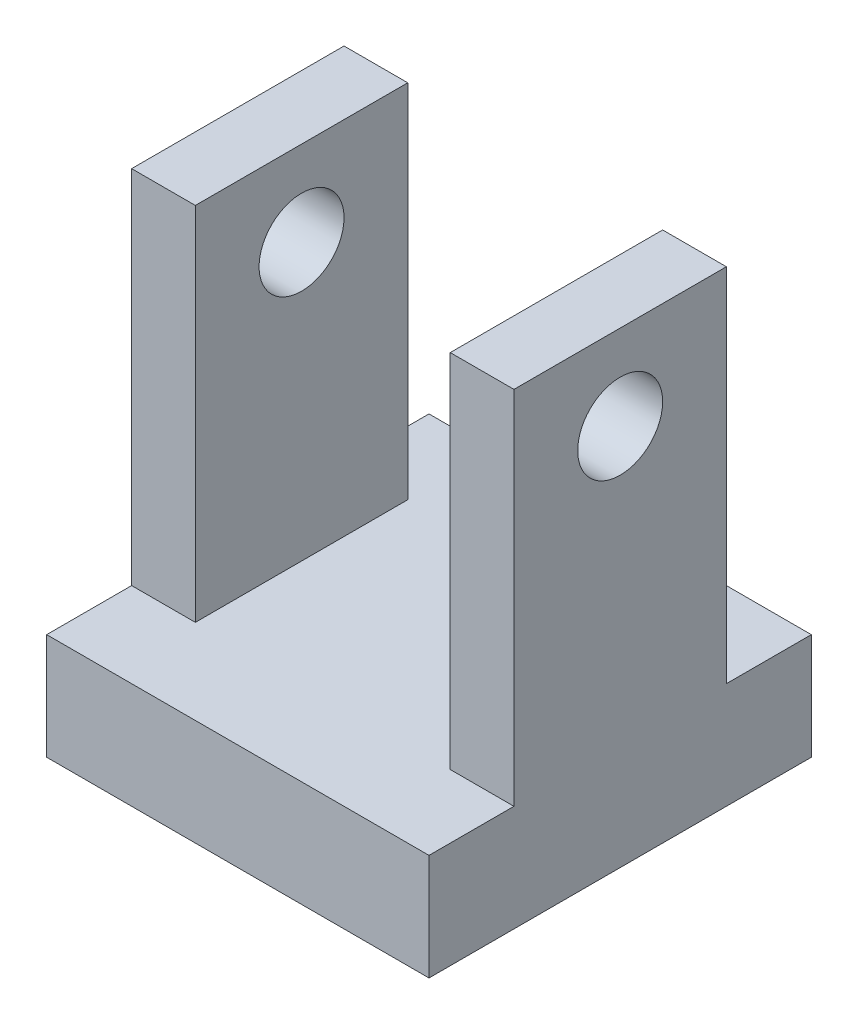
ISO-10303-21;
HEADER;
FILE_DESCRIPTION(('STEP AP214'),'2;1');
FILE_NAME('part.step','',(''),(''),'','','');
FILE_SCHEMA(('AUTOMOTIVE_DESIGN { 1 0 10303 214 1 1 1 1 }'));
ENDSEC;
DATA;
#1=APPLICATION_CONTEXT('core data for automotive mechanical design processes');
#2=APPLICATION_PROTOCOL_DEFINITION('international standard','automotive_design',2000,#1);
#3=PRODUCT_CONTEXT('',#1,'mechanical');
#4=PRODUCT('Part','Part','',(#3));
#5=PRODUCT_RELATED_PRODUCT_CATEGORY('part','',(#4));
#6=PRODUCT_DEFINITION_FORMATION('','',#4);
#7=PRODUCT_DEFINITION_CONTEXT('part definition',#1,'design');
#8=PRODUCT_DEFINITION('design','',#6,#7);
#9=PRODUCT_DEFINITION_SHAPE('','',#8);
#10=(LENGTH_UNIT() NAMED_UNIT(*) SI_UNIT(.MILLI.,.METRE.));
#11=(NAMED_UNIT(*) PLANE_ANGLE_UNIT() SI_UNIT($,.RADIAN.));
#12=(NAMED_UNIT(*) SI_UNIT($,.STERADIAN.) SOLID_ANGLE_UNIT());
#13=UNCERTAINTY_MEASURE_WITH_UNIT(LENGTH_MEASURE(1.E-05),#10,'distance_accuracy_value','');
#14=(GEOMETRIC_REPRESENTATION_CONTEXT(3) GLOBAL_UNCERTAINTY_ASSIGNED_CONTEXT((#13)) GLOBAL_UNIT_ASSIGNED_CONTEXT((#10,
#11,#12)) REPRESENTATION_CONTEXT('',''));
#15=CARTESIAN_POINT('',(0.,0.,0.));
#16=DIRECTION('',(0.,0.,1.));
#17=DIRECTION('',(1.,0.,0.));
#18=AXIS2_PLACEMENT_3D('',#15,#16,#17);
#19=CARTESIAN_POINT('',(45.,110.,-25.));
#20=DIRECTION('',(0.,0.,1.));
#21=DIRECTION('',(0.,-1.,0.));
#22=AXIS2_PLACEMENT_3D('',#19,#20,#21);
#23=PLANE('',#22);
#24=DIRECTION('',(-1.,0.,0.));
#25=VECTOR('',#24,1.);
#26=CARTESIAN_POINT('',(45.,110.,-25.));
#27=LINE('',#26,#25);
#28=CARTESIAN_POINT('',(-30.,110.,-25.));
#29=VERTEX_POINT('',#28);
#30=CARTESIAN_POINT('',(-45.,110.,-25.));
#31=VERTEX_POINT('',#30);
#32=EDGE_CURVE('E140',#29,#31,#27,.T.);
#33=ORIENTED_EDGE('',*,*,#32,.F.);
#34=DIRECTION('',(0.,-1.,0.));
#35=VECTOR('',#34,1.);
#36=CARTESIAN_POINT('',(-30.,110.,-25.));
#37=LINE('',#36,#35);
#38=CARTESIAN_POINT('',(-30.,25.,-25.));
#39=VERTEX_POINT('',#38);
#40=EDGE_CURVE('E155',#29,#39,#37,.T.);
#41=ORIENTED_EDGE('',*,*,#40,.T.);
#42=DIRECTION('',(-1.,0.,0.));
#43=VECTOR('',#42,1.);
#44=CARTESIAN_POINT('',(45.,25.,-25.));
#45=LINE('',#44,#43);
#46=CARTESIAN_POINT('',(-45.,25.,-25.));
#47=VERTEX_POINT('',#46);
#48=EDGE_CURVE('E179',#39,#47,#45,.T.);
#49=ORIENTED_EDGE('',*,*,#48,.T.);
#50=DIRECTION('',(0.,1.,0.));
#51=VECTOR('',#50,1.);
#52=CARTESIAN_POINT('',(-45.,110.,-25.));
#53=LINE('',#52,#51);
#54=EDGE_CURVE('E163',#47,#31,#53,.T.);
#55=ORIENTED_EDGE('',*,*,#54,.T.);
#56=EDGE_LOOP('',(#33,#41,#49,#55));
#57=FACE_BOUND('',#56,.T.);
#58=ADVANCED_FACE('F39',(#57),#23,.F.);
#59=CARTESIAN_POINT('',(45.,110.,25.));
#60=DIRECTION('',(0.,-1.,0.));
#61=DIRECTION('',(0.,0.,-1.));
#62=AXIS2_PLACEMENT_3D('',#59,#60,#61);
#63=PLANE('',#62);
#64=DIRECTION('',(-1.,0.,0.));
#65=VECTOR('',#64,1.);
#66=CARTESIAN_POINT('',(45.,110.,25.));
#67=LINE('',#66,#65);
#68=CARTESIAN_POINT('',(-30.,110.,25.));
#69=VERTEX_POINT('',#68);
#70=CARTESIAN_POINT('',(-45.,110.,25.));
#71=VERTEX_POINT('',#70);
#72=EDGE_CURVE('E141',#69,#71,#67,.T.);
#73=ORIENTED_EDGE('',*,*,#72,.F.);
#74=DIRECTION('',(0.,0.,1.));
#75=VECTOR('',#74,1.);
#76=CARTESIAN_POINT('',(-30.,110.,-65.));
#77=LINE('',#76,#75);
#78=EDGE_CURVE('E215',#29,#69,#77,.T.);
#79=ORIENTED_EDGE('',*,*,#78,.F.);
#80=ORIENTED_EDGE('',*,*,#32,.T.);
#81=DIRECTION('',(0.,0.,1.));
#82=VECTOR('',#81,1.);
#83=CARTESIAN_POINT('',(-45.,110.,25.));
#84=LINE('',#83,#82);
#85=EDGE_CURVE('E166',#31,#71,#84,.T.);
#86=ORIENTED_EDGE('',*,*,#85,.T.);
#87=EDGE_LOOP('',(#73,#79,#80,#86));
#88=FACE_BOUND('',#87,.T.);
#89=ADVANCED_FACE('F256',(#88),#63,.F.);
#90=CARTESIAN_POINT('',(45.,25.,25.));
#91=DIRECTION('',(0.,0.,-1.));
#92=DIRECTION('',(-1.,0.,0.));
#93=AXIS2_PLACEMENT_3D('',#90,#91,#92);
#94=PLANE('',#93);
#95=DIRECTION('',(-1.,0.,0.));
#96=VECTOR('',#95,1.);
#97=CARTESIAN_POINT('',(45.,25.,25.));
#98=LINE('',#97,#96);
#99=CARTESIAN_POINT('',(-30.,25.,25.));
#100=VERTEX_POINT('',#99);
#101=CARTESIAN_POINT('',(-45.,25.,25.));
#102=VERTEX_POINT('',#101);
#103=EDGE_CURVE('E175',#100,#102,#98,.T.);
#104=ORIENTED_EDGE('',*,*,#103,.F.);
#105=DIRECTION('',(0.,-1.,0.));
#106=VECTOR('',#105,1.);
#107=CARTESIAN_POINT('',(-30.,25.,25.));
#108=LINE('',#107,#106);
#109=EDGE_CURVE('E55',#69,#100,#108,.T.);
#110=ORIENTED_EDGE('',*,*,#109,.F.);
#111=ORIENTED_EDGE('',*,*,#72,.T.);
#112=DIRECTION('',(0.,-1.,0.));
#113=VECTOR('',#112,1.);
#114=CARTESIAN_POINT('',(-45.,25.,25.));
#115=LINE('',#114,#113);
#116=EDGE_CURVE('E169',#71,#102,#115,.T.);
#117=ORIENTED_EDGE('',*,*,#116,.T.);
#118=EDGE_LOOP('',(#104,#110,#111,#117));
#119=FACE_BOUND('',#118,.T.);
#120=ADVANCED_FACE('F264',(#119),#94,.F.);
#121=CARTESIAN_POINT('',(45.,0.,45.));
#122=DIRECTION('',(0.,0.,-1.));
#123=DIRECTION('',(-1.,0.,0.));
#124=AXIS2_PLACEMENT_3D('',#121,#122,#123);
#125=PLANE('',#124);
#126=DIRECTION('',(0.,-1.,0.));
#127=VECTOR('',#126,1.);
#128=CARTESIAN_POINT('',(-45.,0.,45.));
#129=LINE('',#128,#127);
#130=CARTESIAN_POINT('',(-45.,25.,45.));
#131=VERTEX_POINT('',#130);
#132=CARTESIAN_POINT('',(-45.,0.,45.));
#133=VERTEX_POINT('',#132);
#134=EDGE_CURVE('E151',#131,#133,#129,.T.);
#135=ORIENTED_EDGE('',*,*,#134,.T.);
#136=DIRECTION('',(-1.,0.,0.));
#137=VECTOR('',#136,1.);
#138=CARTESIAN_POINT('',(45.,0.,45.));
#139=LINE('',#138,#137);
#140=CARTESIAN_POINT('',(45.,0.,45.));
#141=VERTEX_POINT('',#140);
#142=EDGE_CURVE('E11',#141,#133,#139,.T.);
#143=ORIENTED_EDGE('',*,*,#142,.F.);
#144=DIRECTION('',(0.,-1.,0.));
#145=VECTOR('',#144,1.);
#146=CARTESIAN_POINT('',(45.,0.,45.));
#147=LINE('',#146,#145);
#148=CARTESIAN_POINT('',(45.,25.,45.));
#149=VERTEX_POINT('',#148);
#150=EDGE_CURVE('E173',#149,#141,#147,.T.);
#151=ORIENTED_EDGE('',*,*,#150,.F.);
#152=DIRECTION('',(-1.,0.,0.));
#153=VECTOR('',#152,1.);
#154=CARTESIAN_POINT('',(45.,25.,45.));
#155=LINE('',#154,#153);
#156=EDGE_CURVE('E147',#149,#131,#155,.T.);
#157=ORIENTED_EDGE('',*,*,#156,.T.);
#158=EDGE_LOOP('',(#135,#143,#151,#157));
#159=FACE_BOUND('',#158,.T.);
#160=ADVANCED_FACE('F41',(#159),#125,.F.);
#161=CARTESIAN_POINT('',(45.,0.,-45.));
#162=DIRECTION('',(0.,1.,0.));
#163=DIRECTION('',(0.,0.,1.));
#164=AXIS2_PLACEMENT_3D('',#161,#162,#163);
#165=PLANE('',#164);
#166=DIRECTION('',(0.,0.,-1.));
#167=VECTOR('',#166,1.);
#168=CARTESIAN_POINT('',(-45.,0.,-45.));
#169=LINE('',#168,#167);
#170=CARTESIAN_POINT('',(-45.,0.,-45.));
#171=VERTEX_POINT('',#170);
#172=EDGE_CURVE('E154',#133,#171,#169,.T.);
#173=ORIENTED_EDGE('',*,*,#172,.T.);
#174=DIRECTION('',(-1.,0.,0.));
#175=VECTOR('',#174,1.);
#176=CARTESIAN_POINT('',(45.,0.,-45.));
#177=LINE('',#176,#175);
#178=CARTESIAN_POINT('',(45.,0.,-45.));
#179=VERTEX_POINT('',#178);
#180=EDGE_CURVE('E48',#179,#171,#177,.T.);
#181=ORIENTED_EDGE('',*,*,#180,.F.);
#182=DIRECTION('',(0.,0.,-1.));
#183=VECTOR('',#182,1.);
#184=CARTESIAN_POINT('',(45.,0.,-45.));
#185=LINE('',#184,#183);
#186=EDGE_CURVE('E104',#141,#179,#185,.T.);
#187=ORIENTED_EDGE('',*,*,#186,.F.);
#188=ORIENTED_EDGE('',*,*,#142,.T.);
#189=EDGE_LOOP('',(#173,#181,#187,#188));
#190=FACE_BOUND('',#189,.T.);
#191=ADVANCED_FACE('F275',(#190),#165,.F.);
#192=CARTESIAN_POINT('',(45.,25.,-45.));
#193=DIRECTION('',(0.,0.,1.));
#194=DIRECTION('',(0.,-1.,0.));
#195=AXIS2_PLACEMENT_3D('',#192,#193,#194);
#196=PLANE('',#195);
#197=DIRECTION('',(0.,1.,0.));
#198=VECTOR('',#197,1.);
#199=CARTESIAN_POINT('',(-45.,25.,-45.));
#200=LINE('',#199,#198);
#201=CARTESIAN_POINT('',(-45.,25.,-45.));
#202=VERTEX_POINT('',#201);
#203=EDGE_CURVE('E157',#171,#202,#200,.T.);
#204=ORIENTED_EDGE('',*,*,#203,.T.);
#205=DIRECTION('',(-1.,0.,0.));
#206=VECTOR('',#205,1.);
#207=CARTESIAN_POINT('',(45.,25.,-45.));
#208=LINE('',#207,#206);
#209=CARTESIAN_POINT('',(45.,25.,-45.));
#210=VERTEX_POINT('',#209);
#211=EDGE_CURVE('E183',#210,#202,#208,.T.);
#212=ORIENTED_EDGE('',*,*,#211,.F.);
#213=DIRECTION('',(0.,1.,0.));
#214=VECTOR('',#213,1.);
#215=CARTESIAN_POINT('',(45.,25.,-45.));
#216=LINE('',#215,#214);
#217=EDGE_CURVE('E192',#179,#210,#216,.T.);
#218=ORIENTED_EDGE('',*,*,#217,.F.);
#219=ORIENTED_EDGE('',*,*,#180,.T.);
#220=EDGE_LOOP('',(#204,#212,#218,#219));
#221=FACE_BOUND('',#220,.T.);
#222=ADVANCED_FACE('F189',(#221),#196,.F.);
#223=CARTESIAN_POINT('',(45.,25.,-25.));
#224=VERTEX_POINT('',#223);
#225=CARTESIAN_POINT('',(30.,25.,-25.));
#226=VERTEX_POINT('',#225);
#227=EDGE_CURVE('E180',#224,#226,#45,.T.);
#228=ORIENTED_EDGE('',*,*,#227,.T.);
#229=DIRECTION('',(0.,1.,0.));
#230=VECTOR('',#229,1.);
#231=CARTESIAN_POINT('',(30.,110.,-25.));
#232=LINE('',#231,#230);
#233=CARTESIAN_POINT('',(30.,110.,-25.));
#234=VERTEX_POINT('',#233);
#235=EDGE_CURVE('E212',#226,#234,#232,.T.);
#236=ORIENTED_EDGE('',*,*,#235,.T.);
#237=CARTESIAN_POINT('',(45.,110.,-25.));
#238=VERTEX_POINT('',#237);
#239=EDGE_CURVE('E177',#238,#234,#27,.T.);
#240=ORIENTED_EDGE('',*,*,#239,.F.);
#241=DIRECTION('',(0.,1.,0.));
#242=VECTOR('',#241,1.);
#243=CARTESIAN_POINT('',(45.,110.,-25.));
#244=LINE('',#243,#242);
#245=EDGE_CURVE('E126',#224,#238,#244,.T.);
#246=ORIENTED_EDGE('',*,*,#245,.F.);
#247=EDGE_LOOP('',(#228,#236,#240,#246));
#248=FACE_BOUND('',#247,.T.);
#249=ADVANCED_FACE('F259',(#248),#23,.F.);
#250=ORIENTED_EDGE('',*,*,#239,.T.);
#251=DIRECTION('',(0.,0.,1.));
#252=VECTOR('',#251,1.);
#253=CARTESIAN_POINT('',(30.,110.,-65.));
#254=LINE('',#253,#252);
#255=CARTESIAN_POINT('',(30.,110.,25.));
#256=VERTEX_POINT('',#255);
#257=EDGE_CURVE('E137',#234,#256,#254,.T.);
#258=ORIENTED_EDGE('',*,*,#257,.T.);
#259=CARTESIAN_POINT('',(45.,110.,25.));
#260=VERTEX_POINT('',#259);
#261=EDGE_CURVE('E133',#260,#256,#67,.T.);
#262=ORIENTED_EDGE('',*,*,#261,.F.);
#263=DIRECTION('',(0.,0.,1.));
#264=VECTOR('',#263,1.);
#265=CARTESIAN_POINT('',(45.,110.,25.));
#266=LINE('',#265,#264);
#267=EDGE_CURVE('E119',#238,#260,#266,.T.);
#268=ORIENTED_EDGE('',*,*,#267,.F.);
#269=EDGE_LOOP('',(#250,#258,#262,#268));
#270=FACE_BOUND('',#269,.T.);
#271=ADVANCED_FACE('F134',(#270),#63,.F.);
#272=ORIENTED_EDGE('',*,*,#261,.T.);
#273=DIRECTION('',(0.,1.,0.));
#274=VECTOR('',#273,1.);
#275=CARTESIAN_POINT('',(30.,110.,25.));
#276=LINE('',#275,#274);
#277=CARTESIAN_POINT('',(30.,25.,25.));
#278=VERTEX_POINT('',#277);
#279=EDGE_CURVE('E219',#278,#256,#276,.T.);
#280=ORIENTED_EDGE('',*,*,#279,.F.);
#281=CARTESIAN_POINT('',(45.,25.,25.));
#282=VERTEX_POINT('',#281);
#283=EDGE_CURVE('E145',#282,#278,#98,.T.);
#284=ORIENTED_EDGE('',*,*,#283,.F.);
#285=DIRECTION('',(0.,-1.,0.));
#286=VECTOR('',#285,1.);
#287=CARTESIAN_POINT('',(45.,25.,25.));
#288=LINE('',#287,#286);
#289=EDGE_CURVE('E123',#260,#282,#288,.T.);
#290=ORIENTED_EDGE('',*,*,#289,.F.);
#291=EDGE_LOOP('',(#272,#280,#284,#290));
#292=FACE_BOUND('',#291,.T.);
#293=ADVANCED_FACE('F143',(#292),#94,.F.);
#294=CARTESIAN_POINT('',(45.,25.,45.));
#295=DIRECTION('',(0.,-1.,0.));
#296=DIRECTION('',(0.,0.,-1.));
#297=AXIS2_PLACEMENT_3D('',#294,#295,#296);
#298=PLANE('',#297);
#299=DIRECTION('',(0.,0.,1.));
#300=VECTOR('',#299,1.);
#301=CARTESIAN_POINT('',(-45.,25.,45.));
#302=LINE('',#301,#300);
#303=EDGE_CURVE('E96',#102,#131,#302,.T.);
#304=ORIENTED_EDGE('',*,*,#303,.T.);
#305=ORIENTED_EDGE('',*,*,#156,.F.);
#306=DIRECTION('',(0.,0.,1.));
#307=VECTOR('',#306,1.);
#308=CARTESIAN_POINT('',(45.,25.,45.));
#309=LINE('',#308,#307);
#310=EDGE_CURVE('E64',#282,#149,#309,.T.);
#311=ORIENTED_EDGE('',*,*,#310,.F.);
#312=ORIENTED_EDGE('',*,*,#283,.T.);
#313=DIRECTION('',(0.,0.,1.));
#314=VECTOR('',#313,1.);
#315=CARTESIAN_POINT('',(30.,25.,-65.));
#316=LINE('',#315,#314);
#317=EDGE_CURVE('E218',#226,#278,#316,.T.);
#318=ORIENTED_EDGE('',*,*,#317,.F.);
#319=ORIENTED_EDGE('',*,*,#227,.F.);
#320=DIRECTION('',(0.,0.,1.));
#321=VECTOR('',#320,1.);
#322=CARTESIAN_POINT('',(45.,25.,-25.));
#323=LINE('',#322,#321);
#324=EDGE_CURVE('E203',#210,#224,#323,.T.);
#325=ORIENTED_EDGE('',*,*,#324,.F.);
#326=ORIENTED_EDGE('',*,*,#211,.T.);
#327=DIRECTION('',(0.,0.,1.));
#328=VECTOR('',#327,1.);
#329=CARTESIAN_POINT('',(-45.,25.,-25.));
#330=LINE('',#329,#328);
#331=EDGE_CURVE('E160',#202,#47,#330,.T.);
#332=ORIENTED_EDGE('',*,*,#331,.T.);
#333=ORIENTED_EDGE('',*,*,#48,.F.);
#334=DIRECTION('',(0.,0.,1.));
#335=VECTOR('',#334,1.);
#336=CARTESIAN_POINT('',(-30.,25.,-65.));
#337=LINE('',#336,#335);
#338=EDGE_CURVE('E216',#39,#100,#337,.T.);
#339=ORIENTED_EDGE('',*,*,#338,.T.);
#340=ORIENTED_EDGE('',*,*,#103,.T.);
#341=EDGE_LOOP('',(#304,#305,#311,#312,#318,#319,#325,#326,#332,#333,#339,#340));
#342=FACE_BOUND('',#341,.T.);
#343=ADVANCED_FACE('F199',(#342),#298,.F.);
#344=CARTESIAN_POINT('',(45.,0.,0.));
#345=DIRECTION('',(-1.,0.,0.));
#346=DIRECTION('',(0.,0.,1.));
#347=AXIS2_PLACEMENT_3D('',#344,#345,#346);
#348=PLANE('',#347);
#349=CARTESIAN_POINT('',(45.,90.,0.));
#350=DIRECTION('',(1.,0.,0.));
#351=DIRECTION('',(0.,0.,-1.));
#352=AXIS2_PLACEMENT_3D('',#349,#350,#351);
#353=CIRCLE('',#352,10.);
#354=CARTESIAN_POINT('',(45.,90.,-10.));
#355=VERTEX_POINT('',#354);
#356=EDGE_CURVE('E230',#355,#355,#353,.T.);
#357=ORIENTED_EDGE('',*,*,#356,.F.);
#358=EDGE_LOOP('',(#357));
#359=FACE_BOUND('',#358,.T.);
#360=ORIENTED_EDGE('',*,*,#150,.T.);
#361=ORIENTED_EDGE('',*,*,#186,.T.);
#362=ORIENTED_EDGE('',*,*,#217,.T.);
#363=ORIENTED_EDGE('',*,*,#324,.T.);
#364=ORIENTED_EDGE('',*,*,#245,.T.);
#365=ORIENTED_EDGE('',*,*,#267,.T.);
#366=ORIENTED_EDGE('',*,*,#289,.T.);
#367=ORIENTED_EDGE('',*,*,#310,.T.);
#368=EDGE_LOOP('',(#360,#361,#362,#363,#364,#365,#366,#367));
#369=FACE_BOUND('',#368,.T.);
#370=ADVANCED_FACE('F121',(#359,#369),#348,.F.);
#371=CARTESIAN_POINT('',(-45.,0.,0.));
#372=DIRECTION('',(-1.,0.,0.));
#373=DIRECTION('',(0.,0.,1.));
#374=AXIS2_PLACEMENT_3D('',#371,#372,#373);
#375=PLANE('',#374);
#376=CARTESIAN_POINT('',(-45.,90.,0.));
#377=DIRECTION('',(1.,0.,0.));
#378=DIRECTION('',(0.,0.,-1.));
#379=AXIS2_PLACEMENT_3D('',#376,#377,#378);
#380=CIRCLE('',#379,10.);
#381=CARTESIAN_POINT('',(-45.,90.,-10.));
#382=VERTEX_POINT('',#381);
#383=EDGE_CURVE('E233',#382,#382,#380,.T.);
#384=ORIENTED_EDGE('',*,*,#383,.T.);
#385=EDGE_LOOP('',(#384));
#386=FACE_BOUND('',#385,.T.);
#387=ORIENTED_EDGE('',*,*,#134,.F.);
#388=ORIENTED_EDGE('',*,*,#303,.F.);
#389=ORIENTED_EDGE('',*,*,#116,.F.);
#390=ORIENTED_EDGE('',*,*,#85,.F.);
#391=ORIENTED_EDGE('',*,*,#54,.F.);
#392=ORIENTED_EDGE('',*,*,#331,.F.);
#393=ORIENTED_EDGE('',*,*,#203,.F.);
#394=ORIENTED_EDGE('',*,*,#172,.F.);
#395=EDGE_LOOP('',(#387,#388,#389,#390,#391,#392,#393,#394));
#396=FACE_BOUND('',#395,.T.);
#397=ADVANCED_FACE('F195',(#386,#396),#375,.T.);
#398=CARTESIAN_POINT('',(-30.,25.,-65.));
#399=DIRECTION('',(-1.,0.,0.));
#400=DIRECTION('',(0.,0.,1.));
#401=AXIS2_PLACEMENT_3D('',#398,#399,#400);
#402=PLANE('',#401);
#403=CARTESIAN_POINT('',(-30.,90.,0.));
#404=DIRECTION('',(-1.,0.,0.));
#405=DIRECTION('',(0.,0.,1.));
#406=AXIS2_PLACEMENT_3D('',#403,#404,#405);
#407=CIRCLE('',#406,10.);
#408=CARTESIAN_POINT('',(-30.,90.,-10.));
#409=VERTEX_POINT('',#408);
#410=EDGE_CURVE('E227',#409,#409,#407,.T.);
#411=ORIENTED_EDGE('',*,*,#410,.T.);
#412=EDGE_LOOP('',(#411));
#413=FACE_BOUND('',#412,.T.);
#414=ORIENTED_EDGE('',*,*,#78,.T.);
#415=ORIENTED_EDGE('',*,*,#109,.T.);
#416=ORIENTED_EDGE('',*,*,#338,.F.);
#417=ORIENTED_EDGE('',*,*,#40,.F.);
#418=EDGE_LOOP('',(#414,#415,#416,#417));
#419=FACE_BOUND('',#418,.T.);
#420=ADVANCED_FACE('F253',(#413,#419),#402,.F.);
#421=CARTESIAN_POINT('',(30.,110.,-65.));
#422=DIRECTION('',(1.,0.,0.));
#423=DIRECTION('',(0.,1.,0.));
#424=AXIS2_PLACEMENT_3D('',#421,#422,#423);
#425=PLANE('',#424);
#426=CARTESIAN_POINT('',(30.,90.,0.));
#427=DIRECTION('',(1.,0.,0.));
#428=DIRECTION('',(0.,1.,0.));
#429=AXIS2_PLACEMENT_3D('',#426,#427,#428);
#430=CIRCLE('',#429,10.);
#431=CARTESIAN_POINT('',(30.,90.,-10.));
#432=VERTEX_POINT('',#431);
#433=EDGE_CURVE('E43',#432,#432,#430,.T.);
#434=ORIENTED_EDGE('',*,*,#433,.T.);
#435=EDGE_LOOP('',(#434));
#436=FACE_BOUND('',#435,.T.);
#437=ORIENTED_EDGE('',*,*,#317,.T.);
#438=ORIENTED_EDGE('',*,*,#279,.T.);
#439=ORIENTED_EDGE('',*,*,#257,.F.);
#440=ORIENTED_EDGE('',*,*,#235,.F.);
#441=EDGE_LOOP('',(#437,#438,#439,#440));
#442=FACE_BOUND('',#441,.T.);
#443=ADVANCED_FACE('F240',(#436,#442),#425,.F.);
#444=CARTESIAN_POINT('',(-45.,90.,0.));
#445=DIRECTION('',(1.,0.,0.));
#446=DIRECTION('',(0.,0.,-1.));
#447=AXIS2_PLACEMENT_3D('',#444,#445,#446);
#448=CYLINDRICAL_SURFACE('',#447,10.);
#449=CARTESIAN_POINT('',(45.,90.,-10.));
#450=CARTESIAN_POINT('',(44.84375,90.,-10.));
#451=CARTESIAN_POINT('',(44.6875,90.,-10.));
#452=CARTESIAN_POINT('',(44.375,90.,-10.));
#453=CARTESIAN_POINT('',(44.21875,90.,-10.));
#454=CARTESIAN_POINT('',(43.90625,90.,-10.));
#455=CARTESIAN_POINT('',(43.75,90.,-10.));
#456=CARTESIAN_POINT('',(43.4375,90.,-10.));
#457=CARTESIAN_POINT('',(43.28125,90.,-10.));
#458=CARTESIAN_POINT('',(42.96875,90.,-10.));
#459=CARTESIAN_POINT('',(42.8125,90.,-10.));
#460=CARTESIAN_POINT('',(42.5,90.,-10.));
#461=CARTESIAN_POINT('',(42.34375,90.,-10.));
#462=CARTESIAN_POINT('',(42.03125,90.,-10.));
#463=CARTESIAN_POINT('',(41.875,90.,-10.));
#464=CARTESIAN_POINT('',(41.5625,90.,-10.));
#465=CARTESIAN_POINT('',(41.40625,90.,-10.));
#466=CARTESIAN_POINT('',(41.09375,90.,-10.));
#467=CARTESIAN_POINT('',(40.9375,90.,-10.));
#468=CARTESIAN_POINT('',(40.625,90.,-10.));
#469=CARTESIAN_POINT('',(40.46875,90.,-10.));
#470=CARTESIAN_POINT('',(40.15625,90.,-10.));
#471=CARTESIAN_POINT('',(40.,90.,-10.));
#472=CARTESIAN_POINT('',(39.6875,90.,-10.));
#473=CARTESIAN_POINT('',(39.53125,90.,-10.));
#474=CARTESIAN_POINT('',(39.21875,90.,-10.));
#475=CARTESIAN_POINT('',(39.0625,90.,-10.));
#476=CARTESIAN_POINT('',(38.75,90.,-10.));
#477=CARTESIAN_POINT('',(38.59375,90.,-10.));
#478=CARTESIAN_POINT('',(38.28125,90.,-10.));
#479=CARTESIAN_POINT('',(38.125,90.,-10.));
#480=CARTESIAN_POINT('',(37.8125,90.,-10.));
#481=CARTESIAN_POINT('',(37.65625,90.,-10.));
#482=CARTESIAN_POINT('',(37.34375,90.,-10.));
#483=CARTESIAN_POINT('',(37.1875,90.,-10.));
#484=CARTESIAN_POINT('',(36.875,90.,-10.));
#485=CARTESIAN_POINT('',(36.71875,90.,-10.));
#486=CARTESIAN_POINT('',(36.40625,90.,-10.));
#487=CARTESIAN_POINT('',(36.25,90.,-10.));
#488=CARTESIAN_POINT('',(35.9375,90.,-10.));
#489=CARTESIAN_POINT('',(35.78125,90.,-10.));
#490=CARTESIAN_POINT('',(35.46875,90.,-10.));
#491=CARTESIAN_POINT('',(35.3125,90.,-10.));
#492=CARTESIAN_POINT('',(35.,90.,-10.));
#493=CARTESIAN_POINT('',(34.84375,90.,-10.));
#494=CARTESIAN_POINT('',(34.53125,90.,-10.));
#495=CARTESIAN_POINT('',(34.375,90.,-10.));
#496=CARTESIAN_POINT('',(34.0625,90.,-10.));
#497=CARTESIAN_POINT('',(33.90625,90.,-10.));
#498=CARTESIAN_POINT('',(33.59375,90.,-10.));
#499=CARTESIAN_POINT('',(33.4375,90.,-10.));
#500=CARTESIAN_POINT('',(33.125,90.,-10.));
#501=CARTESIAN_POINT('',(32.96875,90.,-10.));
#502=CARTESIAN_POINT('',(32.65625,90.,-10.));
#503=CARTESIAN_POINT('',(32.5,90.,-10.));
#504=CARTESIAN_POINT('',(32.1875,90.,-10.));
#505=CARTESIAN_POINT('',(32.03125,90.,-10.));
#506=CARTESIAN_POINT('',(31.71875,90.,-10.));
#507=CARTESIAN_POINT('',(31.5625,90.,-10.));
#508=CARTESIAN_POINT('',(31.25,90.,-10.));
#509=CARTESIAN_POINT('',(31.09375,90.,-10.));
#510=CARTESIAN_POINT('',(30.78125,90.,-10.));
#511=CARTESIAN_POINT('',(30.625,90.,-10.));
#512=CARTESIAN_POINT('',(30.3125,90.,-10.));
#513=CARTESIAN_POINT('',(30.15625,90.,-10.));
#514=CARTESIAN_POINT('',(30.,90.,-10.));
#515=B_SPLINE_CURVE_WITH_KNOTS('',3,(#449,#450,#451,#452,#453,#454,#455,#456,#457,#458,#459,
#460,#461,#462,#463,#464,#465,#466,#467,#468,#469,#470,#471,#472,#473,#474,#475,#476,#477,#478,
#479,#480,#481,#482,#483,#484,#485,#486,#487,#488,#489,#490,#491,#492,#493,#494,#495,#496,#497,
#498,#499,#500,#501,#502,#503,#504,#505,#506,#507,#508,#509,#510,#511,#512,#513,#514),
.UNSPECIFIED.,.F.,.F.,(4,2,2,2,2,2,2,2,2,2,2,2,2,2,2,2,2,2,2,2,2,2,2,2,2,2,2,2,2,2,2,2,4),(0.,
0.468750000000004,0.937500000000008,1.40625,1.875,2.34375000000001,2.8125,3.28125,3.75,
4.21875000000001,4.68750000000001,5.15625,5.62500000000001,6.09375000000001,6.5625,7.03125,
7.50000000000001,7.96875000000001,8.43750000000001,8.90625,9.37500000000001,9.84375000000001,
10.3125,10.78125,11.25,11.71875,12.1875,12.65625,13.125,13.59375,14.0625,14.53125,15.),.UNSPECIFIED.);
#516=EDGE_CURVE('BSEAM243',#355,#432,#515,.T.);
#517=ORIENTED_EDGE('',*,*,#356,.T.);
#518=ORIENTED_EDGE('',*,*,#433,.F.);
#519=ORIENTED_EDGE('',*,*,#516,.T.);
#520=ORIENTED_EDGE('',*,*,#516,.F.);
#521=EDGE_LOOP('',(#517,#519,#518,#520));
#522=FACE_BOUND('',#521,.T.);
#523=ADVANCED_FACE('F243',(#522),#448,.F.);
#524=CARTESIAN_POINT('',(-45.,90.,-10.));
#525=CARTESIAN_POINT('',(-44.84375,90.,-10.));
#526=CARTESIAN_POINT('',(-44.6875,90.,-10.));
#527=CARTESIAN_POINT('',(-44.375,90.,-10.));
#528=CARTESIAN_POINT('',(-44.21875,90.,-10.));
#529=CARTESIAN_POINT('',(-43.90625,90.,-10.));
#530=CARTESIAN_POINT('',(-43.75,90.,-10.));
#531=CARTESIAN_POINT('',(-43.4375,90.,-10.));
#532=CARTESIAN_POINT('',(-43.28125,90.,-10.));
#533=CARTESIAN_POINT('',(-42.96875,90.,-10.));
#534=CARTESIAN_POINT('',(-42.8125,90.,-10.));
#535=CARTESIAN_POINT('',(-42.5,90.,-10.));
#536=CARTESIAN_POINT('',(-42.34375,90.,-10.));
#537=CARTESIAN_POINT('',(-42.03125,90.,-10.));
#538=CARTESIAN_POINT('',(-41.875,90.,-10.));
#539=CARTESIAN_POINT('',(-41.5625,90.,-10.));
#540=CARTESIAN_POINT('',(-41.40625,90.,-10.));
#541=CARTESIAN_POINT('',(-41.09375,90.,-10.));
#542=CARTESIAN_POINT('',(-40.9375,90.,-10.));
#543=CARTESIAN_POINT('',(-40.625,90.,-10.));
#544=CARTESIAN_POINT('',(-40.46875,90.,-10.));
#545=CARTESIAN_POINT('',(-40.15625,90.,-10.));
#546=CARTESIAN_POINT('',(-40.,90.,-10.));
#547=CARTESIAN_POINT('',(-39.6875,90.,-10.));
#548=CARTESIAN_POINT('',(-39.53125,90.,-10.));
#549=CARTESIAN_POINT('',(-39.21875,90.,-10.));
#550=CARTESIAN_POINT('',(-39.0625,90.,-10.));
#551=CARTESIAN_POINT('',(-38.75,90.,-10.));
#552=CARTESIAN_POINT('',(-38.59375,90.,-10.));
#553=CARTESIAN_POINT('',(-38.28125,90.,-10.));
#554=CARTESIAN_POINT('',(-38.125,90.,-10.));
#555=CARTESIAN_POINT('',(-37.8125,90.,-10.));
#556=CARTESIAN_POINT('',(-37.65625,90.,-10.));
#557=CARTESIAN_POINT('',(-37.34375,90.,-10.));
#558=CARTESIAN_POINT('',(-37.1875,90.,-10.));
#559=CARTESIAN_POINT('',(-36.875,90.,-10.));
#560=CARTESIAN_POINT('',(-36.71875,90.,-10.));
#561=CARTESIAN_POINT('',(-36.40625,90.,-10.));
#562=CARTESIAN_POINT('',(-36.25,90.,-10.));
#563=CARTESIAN_POINT('',(-35.9375,90.,-10.));
#564=CARTESIAN_POINT('',(-35.78125,90.,-10.));
#565=CARTESIAN_POINT('',(-35.46875,90.,-10.));
#566=CARTESIAN_POINT('',(-35.3125,90.,-10.));
#567=CARTESIAN_POINT('',(-35.,90.,-10.));
#568=CARTESIAN_POINT('',(-34.84375,90.,-10.));
#569=CARTESIAN_POINT('',(-34.53125,90.,-10.));
#570=CARTESIAN_POINT('',(-34.375,90.,-10.));
#571=CARTESIAN_POINT('',(-34.0625,90.,-10.));
#572=CARTESIAN_POINT('',(-33.90625,90.,-10.));
#573=CARTESIAN_POINT('',(-33.59375,90.,-10.));
#574=CARTESIAN_POINT('',(-33.4375,90.,-10.));
#575=CARTESIAN_POINT('',(-33.125,90.,-10.));
#576=CARTESIAN_POINT('',(-32.96875,90.,-10.));
#577=CARTESIAN_POINT('',(-32.65625,90.,-10.));
#578=CARTESIAN_POINT('',(-32.5,90.,-10.));
#579=CARTESIAN_POINT('',(-32.1875,90.,-10.));
#580=CARTESIAN_POINT('',(-32.03125,90.,-10.));
#581=CARTESIAN_POINT('',(-31.71875,90.,-10.));
#582=CARTESIAN_POINT('',(-31.5625,90.,-10.));
#583=CARTESIAN_POINT('',(-31.25,90.,-10.));
#584=CARTESIAN_POINT('',(-31.09375,90.,-10.));
#585=CARTESIAN_POINT('',(-30.78125,90.,-10.));
#586=CARTESIAN_POINT('',(-30.625,90.,-10.));
#587=CARTESIAN_POINT('',(-30.3125,90.,-10.));
#588=CARTESIAN_POINT('',(-30.15625,90.,-10.));
#589=CARTESIAN_POINT('',(-30.,90.,-10.));
#590=B_SPLINE_CURVE_WITH_KNOTS('',3,(#524,#525,#526,#527,#528,#529,#530,#531,#532,#533,#534,
#535,#536,#537,#538,#539,#540,#541,#542,#543,#544,#545,#546,#547,#548,#549,#550,#551,#552,#553,
#554,#555,#556,#557,#558,#559,#560,#561,#562,#563,#564,#565,#566,#567,#568,#569,#570,#571,#572,
#573,#574,#575,#576,#577,#578,#579,#580,#581,#582,#583,#584,#585,#586,#587,#588,#589),
.UNSPECIFIED.,.F.,.F.,(4,2,2,2,2,2,2,2,2,2,2,2,2,2,2,2,2,2,2,2,2,2,2,2,2,2,2,2,2,2,2,2,4),(0.,
0.468749999999997,0.937499999999994,1.40625,1.87499999999999,2.34375,2.8125,3.28125,3.75,
4.21875,4.6875,5.15625,5.625,6.09374999999999,6.5625,7.03125,7.5,7.96875,8.4375,8.90625,9.375,
9.84375,10.3125,10.78125,11.25,11.71875,12.1875,12.65625,13.125,13.59375,14.0625,14.53125,15.),.UNSPECIFIED.);
#591=EDGE_CURVE('BSEAM245',#382,#409,#590,.T.);
#592=ORIENTED_EDGE('',*,*,#383,.F.);
#593=ORIENTED_EDGE('',*,*,#410,.F.);
#594=ORIENTED_EDGE('',*,*,#591,.T.);
#595=ORIENTED_EDGE('',*,*,#591,.F.);
#596=EDGE_LOOP('',(#592,#594,#593,#595));
#597=FACE_BOUND('',#596,.T.);
#598=ADVANCED_FACE('F245',(#597),#448,.F.);
#599=CLOSED_SHELL('',(#58,#89,#120,#160,#191,#222,#249,#271,#293,#343,#370,#397,#420,#443,#523,#598));
#600=MANIFOLD_SOLID_BREP('B2',#599);
#601=ADVANCED_BREP_SHAPE_REPRESENTATION('',(#18,#600),#14);
#602=SHAPE_DEFINITION_REPRESENTATION(#9,#601);
ENDSEC;
END-ISO-10303-21;
